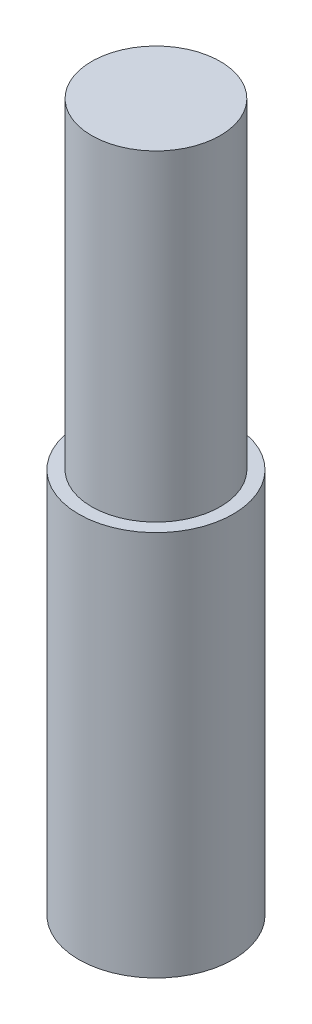
ISO-10303-21;
HEADER;
FILE_DESCRIPTION(('STEP AP214'),'2;1');
FILE_NAME('part.step','',(''),(''),'','','');
FILE_SCHEMA(('AUTOMOTIVE_DESIGN { 1 0 10303 214 1 1 1 1 }'));
ENDSEC;
DATA;
#1=APPLICATION_CONTEXT('core data for automotive mechanical design processes');
#2=APPLICATION_PROTOCOL_DEFINITION('international standard','automotive_design',2000,#1);
#3=PRODUCT_CONTEXT('',#1,'mechanical');
#4=PRODUCT('Part','Part','',(#3));
#5=PRODUCT_RELATED_PRODUCT_CATEGORY('part','',(#4));
#6=PRODUCT_DEFINITION_FORMATION('','',#4);
#7=PRODUCT_DEFINITION_CONTEXT('part definition',#1,'design');
#8=PRODUCT_DEFINITION('design','',#6,#7);
#9=PRODUCT_DEFINITION_SHAPE('','',#8);
#10=(LENGTH_UNIT() NAMED_UNIT(*) SI_UNIT(.MILLI.,.METRE.));
#11=(NAMED_UNIT(*) PLANE_ANGLE_UNIT() SI_UNIT($,.RADIAN.));
#12=(NAMED_UNIT(*) SI_UNIT($,.STERADIAN.) SOLID_ANGLE_UNIT());
#13=UNCERTAINTY_MEASURE_WITH_UNIT(LENGTH_MEASURE(1.E-05),#10,'distance_accuracy_value','');
#14=(GEOMETRIC_REPRESENTATION_CONTEXT(3) GLOBAL_UNCERTAINTY_ASSIGNED_CONTEXT((#13)) GLOBAL_UNIT_ASSIGNED_CONTEXT((#10,
#11,#12)) REPRESENTATION_CONTEXT('',''));
#15=CARTESIAN_POINT('',(0.,0.,0.));
#16=DIRECTION('',(0.,0.,1.));
#17=DIRECTION('',(1.,0.,0.));
#18=AXIS2_PLACEMENT_3D('',#15,#16,#17);
#19=CARTESIAN_POINT('',(0.,60.,0.));
#20=DIRECTION('',(0.,-1.,0.));
#21=DIRECTION('',(0.,0.,-1.));
#22=AXIS2_PLACEMENT_3D('',#19,#20,#21);
#23=CYLINDRICAL_SURFACE('',#22,12.);
#24=CARTESIAN_POINT('',(0.,60.,0.));
#25=DIRECTION('',(0.,1.,0.));
#26=DIRECTION('',(0.,0.,1.));
#27=AXIS2_PLACEMENT_3D('',#24,#25,#26);
#28=CIRCLE('',#27,12.);
#29=CARTESIAN_POINT('',(0.,60.,12.));
#30=VERTEX_POINT('',#29);
#31=EDGE_CURVE('E45',#30,#30,#28,.T.);
#32=ORIENTED_EDGE('',*,*,#31,.F.);
#33=EDGE_LOOP('',(#32));
#34=FACE_BOUND('',#33,.T.);
#35=CARTESIAN_POINT('',(0.,0.,0.));
#36=DIRECTION('',(0.,1.,0.));
#37=DIRECTION('',(0.,0.,1.));
#38=AXIS2_PLACEMENT_3D('',#35,#36,#37);
#39=CIRCLE('',#38,12.);
#40=CARTESIAN_POINT('',(0.,0.,12.));
#41=VERTEX_POINT('',#40);
#42=EDGE_CURVE('E40',#41,#41,#39,.T.);
#43=ORIENTED_EDGE('',*,*,#42,.T.);
#44=EDGE_LOOP('',(#43));
#45=FACE_BOUND('',#44,.T.);
#46=ADVANCED_FACE('F37',(#34,#45),#23,.T.);
#47=CARTESIAN_POINT('',(0.,60.,0.));
#48=DIRECTION('',(0.,1.,0.));
#49=DIRECTION('',(0.,0.,1.));
#50=AXIS2_PLACEMENT_3D('',#47,#48,#49);
#51=PLANE('',#50);
#52=CARTESIAN_POINT('',(0.,60.,0.));
#53=DIRECTION('',(0.,1.,0.));
#54=DIRECTION('',(0.,0.,1.));
#55=AXIS2_PLACEMENT_3D('',#52,#53,#54);
#56=CIRCLE('',#55,10.);
#57=CARTESIAN_POINT('',(0.,60.,10.));
#58=VERTEX_POINT('',#57);
#59=EDGE_CURVE('E10',#58,#58,#56,.T.);
#60=ORIENTED_EDGE('',*,*,#59,.F.);
#61=EDGE_LOOP('',(#60));
#62=FACE_BOUND('',#61,.T.);
#63=ORIENTED_EDGE('',*,*,#31,.T.);
#64=EDGE_LOOP('',(#63));
#65=FACE_BOUND('',#64,.T.);
#66=ADVANCED_FACE('F65',(#62,#65),#51,.T.);
#67=CARTESIAN_POINT('',(0.,0.,0.));
#68=DIRECTION('',(0.,1.,0.));
#69=DIRECTION('',(0.,0.,1.));
#70=AXIS2_PLACEMENT_3D('',#67,#68,#69);
#71=PLANE('',#70);
#72=ORIENTED_EDGE('',*,*,#42,.F.);
#73=EDGE_LOOP('',(#72));
#74=FACE_BOUND('',#73,.T.);
#75=ADVANCED_FACE('F62',(#74),#71,.F.);
#76=CARTESIAN_POINT('',(0.,110.,0.));
#77=DIRECTION('',(0.,-1.,0.));
#78=DIRECTION('',(0.,0.,-1.));
#79=AXIS2_PLACEMENT_3D('',#76,#77,#78);
#80=CYLINDRICAL_SURFACE('',#79,10.);
#81=CARTESIAN_POINT('',(0.,110.,0.));
#82=DIRECTION('',(0.,1.,0.));
#83=DIRECTION('',(0.,0.,1.));
#84=AXIS2_PLACEMENT_3D('',#81,#82,#83);
#85=CIRCLE('',#84,10.);
#86=CARTESIAN_POINT('',(0.,110.,10.));
#87=VERTEX_POINT('',#86);
#88=EDGE_CURVE('E52',#87,#87,#85,.T.);
#89=ORIENTED_EDGE('',*,*,#88,.F.);
#90=EDGE_LOOP('',(#89));
#91=FACE_BOUND('',#90,.T.);
#92=ORIENTED_EDGE('',*,*,#59,.T.);
#93=EDGE_LOOP('',(#92));
#94=FACE_BOUND('',#93,.T.);
#95=ADVANCED_FACE('F64',(#91,#94),#80,.T.);
#96=CARTESIAN_POINT('',(0.,110.,0.));
#97=DIRECTION('',(0.,1.,0.));
#98=DIRECTION('',(0.,0.,1.));
#99=AXIS2_PLACEMENT_3D('',#96,#97,#98);
#100=PLANE('',#99);
#101=ORIENTED_EDGE('',*,*,#88,.T.);
#102=EDGE_LOOP('',(#101));
#103=FACE_BOUND('',#102,.T.);
#104=ADVANCED_FACE('F70',(#103),#100,.T.);
#105=CLOSED_SHELL('',(#46,#66,#75,#95,#104));
#106=MANIFOLD_SOLID_BREP('B2',#105);
#107=ADVANCED_BREP_SHAPE_REPRESENTATION('',(#18,#106),#14);
#108=SHAPE_DEFINITION_REPRESENTATION(#9,#107);
ENDSEC;
END-ISO-10303-21;
